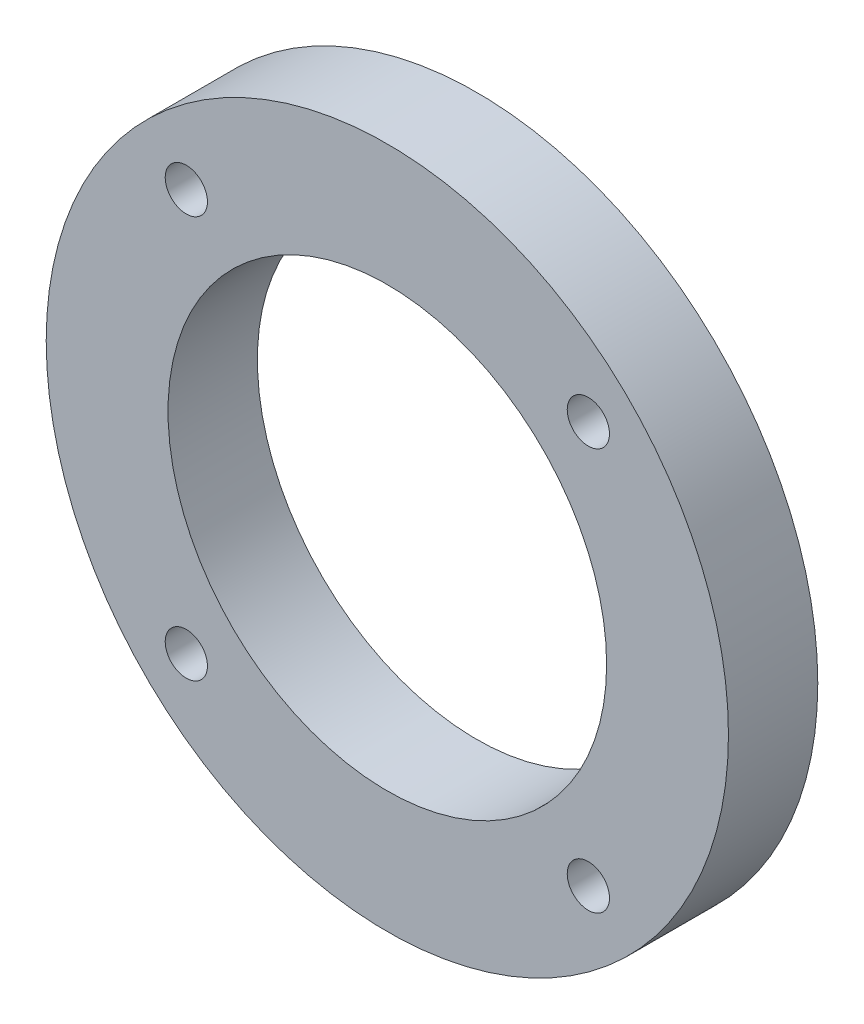
ISO-10303-21;
HEADER;
FILE_DESCRIPTION(('STEP AP214'),'2;1');
FILE_NAME('part.step','',(''),(''),'','','');
FILE_SCHEMA(('AUTOMOTIVE_DESIGN { 1 0 10303 214 1 1 1 1 }'));
ENDSEC;
DATA;
#1=APPLICATION_CONTEXT('core data for automotive mechanical design processes');
#2=APPLICATION_PROTOCOL_DEFINITION('international standard','automotive_design',2000,#1);
#3=PRODUCT_CONTEXT('',#1,'mechanical');
#4=PRODUCT('Part','Part','',(#3));
#5=PRODUCT_RELATED_PRODUCT_CATEGORY('part','',(#4));
#6=PRODUCT_DEFINITION_FORMATION('','',#4);
#7=PRODUCT_DEFINITION_CONTEXT('part definition',#1,'design');
#8=PRODUCT_DEFINITION('design','',#6,#7);
#9=PRODUCT_DEFINITION_SHAPE('','',#8);
#10=(LENGTH_UNIT() NAMED_UNIT(*) SI_UNIT(.MILLI.,.METRE.));
#11=(NAMED_UNIT(*) PLANE_ANGLE_UNIT() SI_UNIT($,.RADIAN.));
#12=(NAMED_UNIT(*) SI_UNIT($,.STERADIAN.) SOLID_ANGLE_UNIT());
#13=UNCERTAINTY_MEASURE_WITH_UNIT(LENGTH_MEASURE(1.E-05),#10,'distance_accuracy_value','');
#14=(GEOMETRIC_REPRESENTATION_CONTEXT(3) GLOBAL_UNCERTAINTY_ASSIGNED_CONTEXT((#13)) GLOBAL_UNIT_ASSIGNED_CONTEXT((#10,
#11,#12)) REPRESENTATION_CONTEXT('',''));
#15=CARTESIAN_POINT('',(0.,0.,0.));
#16=DIRECTION('',(0.,0.,1.));
#17=DIRECTION('',(1.,0.,0.));
#18=AXIS2_PLACEMENT_3D('',#15,#16,#17);
#19=CARTESIAN_POINT('',(0.,0.,5.5));
#20=DIRECTION('',(0.,0.,1.));
#21=DIRECTION('',(1.,0.,0.));
#22=AXIS2_PLACEMENT_3D('',#19,#20,#21);
#23=PLANE('',#22);
#24=CARTESIAN_POINT('',(12.3743686707646,-12.3743686707646,5.5));
#25=DIRECTION('',(0.,0.,1.));
#26=DIRECTION('',(1.,0.,0.));
#27=AXIS2_PLACEMENT_3D('',#24,#25,#26);
#28=CIRCLE('',#27,1.3);
#29=CARTESIAN_POINT('',(13.6743686707646,-12.3743686707646,5.5));
#30=VERTEX_POINT('',#29);
#31=EDGE_CURVE('E48',#30,#30,#28,.T.);
#32=ORIENTED_EDGE('',*,*,#31,.F.);
#33=EDGE_LOOP('',(#32));
#34=FACE_BOUND('',#33,.T.);
#35=CARTESIAN_POINT('',(-12.3743686707646,-12.3743686707646,5.5));
#36=DIRECTION('',(0.,0.,1.));
#37=DIRECTION('',(1.,0.,0.));
#38=AXIS2_PLACEMENT_3D('',#35,#36,#37);
#39=CIRCLE('',#38,1.3);
#40=CARTESIAN_POINT('',(-11.0743686707646,-12.3743686707646,5.5));
#41=VERTEX_POINT('',#40);
#42=EDGE_CURVE('E53',#41,#41,#39,.T.);
#43=ORIENTED_EDGE('',*,*,#42,.F.);
#44=EDGE_LOOP('',(#43));
#45=FACE_BOUND('',#44,.T.);
#46=CARTESIAN_POINT('',(-12.3743686707646,12.3743686707646,5.5));
#47=DIRECTION('',(0.,0.,1.));
#48=DIRECTION('',(1.,0.,0.));
#49=AXIS2_PLACEMENT_3D('',#46,#47,#48);
#50=CIRCLE('',#49,1.3);
#51=CARTESIAN_POINT('',(-11.0743686707646,12.3743686707646,5.5));
#52=VERTEX_POINT('',#51);
#53=EDGE_CURVE('E56',#52,#52,#50,.T.);
#54=ORIENTED_EDGE('',*,*,#53,.F.);
#55=EDGE_LOOP('',(#54));
#56=FACE_BOUND('',#55,.T.);
#57=CARTESIAN_POINT('',(12.3743686707646,12.3743686707646,5.5));
#58=DIRECTION('',(0.,0.,1.));
#59=DIRECTION('',(1.,0.,0.));
#60=AXIS2_PLACEMENT_3D('',#57,#58,#59);
#61=CIRCLE('',#60,1.3);
#62=CARTESIAN_POINT('',(13.6743686707646,12.3743686707646,5.5));
#63=VERTEX_POINT('',#62);
#64=EDGE_CURVE('E59',#63,#63,#61,.T.);
#65=ORIENTED_EDGE('',*,*,#64,.F.);
#66=EDGE_LOOP('',(#65));
#67=FACE_BOUND('',#66,.T.);
#68=CARTESIAN_POINT('',(0.,0.,5.5));
#69=DIRECTION('',(0.,0.,1.));
#70=DIRECTION('',(1.,0.,0.));
#71=AXIS2_PLACEMENT_3D('',#68,#69,#70);
#72=CIRCLE('',#71,21.);
#73=CARTESIAN_POINT('',(21.,0.,5.5));
#74=VERTEX_POINT('',#73);
#75=EDGE_CURVE('E10',#74,#74,#72,.T.);
#76=ORIENTED_EDGE('',*,*,#75,.T.);
#77=EDGE_LOOP('',(#76));
#78=FACE_BOUND('',#77,.T.);
#79=CARTESIAN_POINT('',(0.,0.,5.5));
#80=DIRECTION('',(0.,0.,1.));
#81=DIRECTION('',(1.,0.,0.));
#82=AXIS2_PLACEMENT_3D('',#79,#80,#81);
#83=CIRCLE('',#82,13.5);
#84=CARTESIAN_POINT('',(13.5,0.,5.5));
#85=VERTEX_POINT('',#84);
#86=EDGE_CURVE('E43',#85,#85,#83,.T.);
#87=ORIENTED_EDGE('',*,*,#86,.F.);
#88=EDGE_LOOP('',(#87));
#89=FACE_BOUND('',#88,.T.);
#90=ADVANCED_FACE('F32',(#34,#45,#56,#67,#78,#89),#23,.T.);
#91=CARTESIAN_POINT('',(0.,0.,0.));
#92=DIRECTION('',(0.,0.,1.));
#93=DIRECTION('',(1.,0.,0.));
#94=AXIS2_PLACEMENT_3D('',#91,#92,#93);
#95=PLANE('',#94);
#96=CARTESIAN_POINT('',(12.3743686707646,-12.3743686707646,0.));
#97=DIRECTION('',(0.,0.,-1.));
#98=DIRECTION('',(-1.,0.,0.));
#99=AXIS2_PLACEMENT_3D('',#96,#97,#98);
#100=CIRCLE('',#99,1.3);
#101=CARTESIAN_POINT('',(11.0743686707646,-12.3743686707646,0.));
#102=VERTEX_POINT('',#101);
#103=EDGE_CURVE('E66',#102,#102,#100,.T.);
#104=ORIENTED_EDGE('',*,*,#103,.F.);
#105=EDGE_LOOP('',(#104));
#106=FACE_BOUND('',#105,.T.);
#107=CARTESIAN_POINT('',(-12.3743686707646,-12.3743686707646,0.));
#108=DIRECTION('',(0.,0.,-1.));
#109=DIRECTION('',(-1.,0.,0.));
#110=AXIS2_PLACEMENT_3D('',#107,#108,#109);
#111=CIRCLE('',#110,1.3);
#112=CARTESIAN_POINT('',(-13.6743686707646,-12.3743686707646,0.));
#113=VERTEX_POINT('',#112);
#114=EDGE_CURVE('E69',#113,#113,#111,.T.);
#115=ORIENTED_EDGE('',*,*,#114,.F.);
#116=EDGE_LOOP('',(#115));
#117=FACE_BOUND('',#116,.T.);
#118=CARTESIAN_POINT('',(-12.3743686707646,12.3743686707646,0.));
#119=DIRECTION('',(0.,0.,-1.));
#120=DIRECTION('',(-1.,0.,0.));
#121=AXIS2_PLACEMENT_3D('',#118,#119,#120);
#122=CIRCLE('',#121,1.3);
#123=CARTESIAN_POINT('',(-13.6743686707646,12.3743686707646,0.));
#124=VERTEX_POINT('',#123);
#125=EDGE_CURVE('E65',#124,#124,#122,.T.);
#126=ORIENTED_EDGE('',*,*,#125,.F.);
#127=EDGE_LOOP('',(#126));
#128=FACE_BOUND('',#127,.T.);
#129=CARTESIAN_POINT('',(12.3743686707646,12.3743686707646,0.));
#130=DIRECTION('',(0.,0.,-1.));
#131=DIRECTION('',(-1.,0.,0.));
#132=AXIS2_PLACEMENT_3D('',#129,#130,#131);
#133=CIRCLE('',#132,1.3);
#134=CARTESIAN_POINT('',(11.0743686707646,12.3743686707646,0.));
#135=VERTEX_POINT('',#134);
#136=EDGE_CURVE('E62',#135,#135,#133,.T.);
#137=ORIENTED_EDGE('',*,*,#136,.F.);
#138=EDGE_LOOP('',(#137));
#139=FACE_BOUND('',#138,.T.);
#140=CARTESIAN_POINT('',(0.,0.,0.));
#141=DIRECTION('',(0.,0.,1.));
#142=DIRECTION('',(1.,0.,0.));
#143=AXIS2_PLACEMENT_3D('',#140,#141,#142);
#144=CIRCLE('',#143,21.);
#145=CARTESIAN_POINT('',(21.,0.,0.));
#146=VERTEX_POINT('',#145);
#147=EDGE_CURVE('E36',#146,#146,#144,.T.);
#148=ORIENTED_EDGE('',*,*,#147,.F.);
#149=EDGE_LOOP('',(#148));
#150=FACE_BOUND('',#149,.T.);
#151=CARTESIAN_POINT('',(0.,0.,0.));
#152=DIRECTION('',(0.,0.,1.));
#153=DIRECTION('',(1.,0.,0.));
#154=AXIS2_PLACEMENT_3D('',#151,#152,#153);
#155=CIRCLE('',#154,13.5);
#156=CARTESIAN_POINT('',(13.5,0.,0.));
#157=VERTEX_POINT('',#156);
#158=EDGE_CURVE('E45',#157,#157,#155,.T.);
#159=ORIENTED_EDGE('',*,*,#158,.T.);
#160=EDGE_LOOP('',(#159));
#161=FACE_BOUND('',#160,.T.);
#162=ADVANCED_FACE('F77',(#106,#117,#128,#139,#150,#161),#95,.F.);
#163=CARTESIAN_POINT('',(0.,0.,5.5));
#164=DIRECTION('',(0.,0.,-1.));
#165=DIRECTION('',(-1.,0.,0.));
#166=AXIS2_PLACEMENT_3D('',#163,#164,#165);
#167=CYLINDRICAL_SURFACE('',#166,21.);
#168=ORIENTED_EDGE('',*,*,#75,.F.);
#169=EDGE_LOOP('',(#168));
#170=FACE_BOUND('',#169,.T.);
#171=ORIENTED_EDGE('',*,*,#147,.T.);
#172=EDGE_LOOP('',(#171));
#173=FACE_BOUND('',#172,.T.);
#174=ADVANCED_FACE('F34',(#170,#173),#167,.T.);
#175=CARTESIAN_POINT('',(0.,0.,5.5));
#176=DIRECTION('',(0.,0.,-1.));
#177=DIRECTION('',(-1.,0.,0.));
#178=AXIS2_PLACEMENT_3D('',#175,#176,#177);
#179=CYLINDRICAL_SURFACE('',#178,13.5);
#180=ORIENTED_EDGE('',*,*,#86,.T.);
#181=EDGE_LOOP('',(#180));
#182=FACE_BOUND('',#181,.T.);
#183=ORIENTED_EDGE('',*,*,#158,.F.);
#184=EDGE_LOOP('',(#183));
#185=FACE_BOUND('',#184,.T.);
#186=ADVANCED_FACE('F87',(#182,#185),#179,.F.);
#187=CARTESIAN_POINT('',(12.3743686707646,12.3743686707646,8.));
#188=DIRECTION('',(0.,0.,-1.));
#189=DIRECTION('',(-1.,0.,0.));
#190=AXIS2_PLACEMENT_3D('',#187,#188,#189);
#191=CYLINDRICAL_SURFACE('',#190,1.3);
#192=ORIENTED_EDGE('',*,*,#64,.T.);
#193=EDGE_LOOP('',(#192));
#194=FACE_BOUND('',#193,.T.);
#195=ORIENTED_EDGE('',*,*,#136,.T.);
#196=EDGE_LOOP('',(#195));
#197=FACE_BOUND('',#196,.T.);
#198=ADVANCED_FACE('F89',(#194,#197),#191,.F.);
#199=CARTESIAN_POINT('',(-12.3743686707646,12.3743686707646,8.));
#200=DIRECTION('',(0.,0.,-1.));
#201=DIRECTION('',(-1.,0.,0.));
#202=AXIS2_PLACEMENT_3D('',#199,#200,#201);
#203=CYLINDRICAL_SURFACE('',#202,1.3);
#204=ORIENTED_EDGE('',*,*,#53,.T.);
#205=EDGE_LOOP('',(#204));
#206=FACE_BOUND('',#205,.T.);
#207=ORIENTED_EDGE('',*,*,#125,.T.);
#208=EDGE_LOOP('',(#207));
#209=FACE_BOUND('',#208,.T.);
#210=ADVANCED_FACE('F75',(#206,#209),#203,.F.);
#211=CARTESIAN_POINT('',(-12.3743686707646,-12.3743686707646,8.));
#212=DIRECTION('',(0.,0.,-1.));
#213=DIRECTION('',(-1.,0.,0.));
#214=AXIS2_PLACEMENT_3D('',#211,#212,#213);
#215=CYLINDRICAL_SURFACE('',#214,1.3);
#216=ORIENTED_EDGE('',*,*,#42,.T.);
#217=EDGE_LOOP('',(#216));
#218=FACE_BOUND('',#217,.T.);
#219=ORIENTED_EDGE('',*,*,#114,.T.);
#220=EDGE_LOOP('',(#219));
#221=FACE_BOUND('',#220,.T.);
#222=ADVANCED_FACE('F116',(#218,#221),#215,.F.);
#223=CARTESIAN_POINT('',(12.3743686707646,-12.3743686707646,8.));
#224=DIRECTION('',(0.,0.,-1.));
#225=DIRECTION('',(-1.,0.,0.));
#226=AXIS2_PLACEMENT_3D('',#223,#224,#225);
#227=CYLINDRICAL_SURFACE('',#226,1.3);
#228=ORIENTED_EDGE('',*,*,#31,.T.);
#229=EDGE_LOOP('',(#228));
#230=FACE_BOUND('',#229,.T.);
#231=ORIENTED_EDGE('',*,*,#103,.T.);
#232=EDGE_LOOP('',(#231));
#233=FACE_BOUND('',#232,.T.);
#234=ADVANCED_FACE('F121',(#230,#233),#227,.F.);
#235=CLOSED_SHELL('',(#90,#162,#174,#186,#198,#210,#222,#234));
#236=MANIFOLD_SOLID_BREP('B2',#235);
#237=ADVANCED_BREP_SHAPE_REPRESENTATION('',(#18,#236),#14);
#238=SHAPE_DEFINITION_REPRESENTATION(#9,#237);
ENDSEC;
END-ISO-10303-21;
